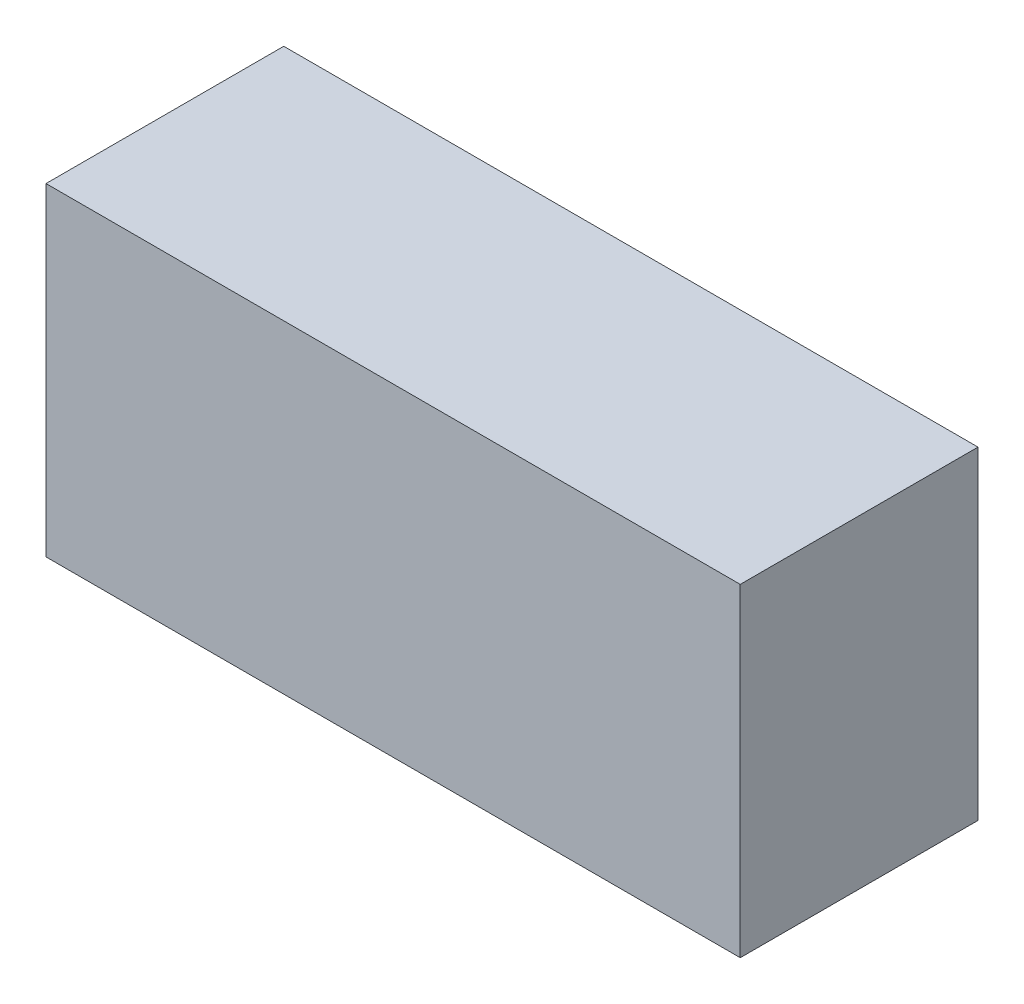
ISO-10303-21;
HEADER;
FILE_DESCRIPTION(('STEP AP214'),'2;1');
FILE_NAME('part.step','',(''),(''),'','','');
FILE_SCHEMA(('AUTOMOTIVE_DESIGN { 1 0 10303 214 1 1 1 1 }'));
ENDSEC;
DATA;
#1=APPLICATION_CONTEXT('core data for automotive mechanical design processes');
#2=APPLICATION_PROTOCOL_DEFINITION('international standard','automotive_design',2000,#1);
#3=PRODUCT_CONTEXT('',#1,'mechanical');
#4=PRODUCT('Part','Part','',(#3));
#5=PRODUCT_RELATED_PRODUCT_CATEGORY('part','',(#4));
#6=PRODUCT_DEFINITION_FORMATION('','',#4);
#7=PRODUCT_DEFINITION_CONTEXT('part definition',#1,'design');
#8=PRODUCT_DEFINITION('design','',#6,#7);
#9=PRODUCT_DEFINITION_SHAPE('','',#8);
#10=(LENGTH_UNIT() NAMED_UNIT(*) SI_UNIT(.MILLI.,.METRE.));
#11=(NAMED_UNIT(*) PLANE_ANGLE_UNIT() SI_UNIT($,.RADIAN.));
#12=(NAMED_UNIT(*) SI_UNIT($,.STERADIAN.) SOLID_ANGLE_UNIT());
#13=UNCERTAINTY_MEASURE_WITH_UNIT(LENGTH_MEASURE(1.E-05),#10,'distance_accuracy_value','');
#14=(GEOMETRIC_REPRESENTATION_CONTEXT(3) GLOBAL_UNCERTAINTY_ASSIGNED_CONTEXT((#13)) GLOBAL_UNIT_ASSIGNED_CONTEXT((#10,
#11,#12)) REPRESENTATION_CONTEXT('',''));
#15=CARTESIAN_POINT('',(0.,0.,0.));
#16=DIRECTION('',(0.,0.,1.));
#17=DIRECTION('',(1.,0.,0.));
#18=AXIS2_PLACEMENT_3D('',#15,#16,#17);
#19=CARTESIAN_POINT('',(36.5,34.,12.5));
#20=DIRECTION('',(-1.,0.,0.));
#21=DIRECTION('',(0.,0.,1.));
#22=AXIS2_PLACEMENT_3D('',#19,#20,#21);
#23=PLANE('',#22);
#24=DIRECTION('',(0.,0.,-1.));
#25=VECTOR('',#24,1.);
#26=CARTESIAN_POINT('',(36.5,0.,12.5));
#27=LINE('',#26,#25);
#28=CARTESIAN_POINT('',(36.5,0.,12.5));
#29=VERTEX_POINT('',#28);
#30=CARTESIAN_POINT('',(36.5,0.,-12.5));
#31=VERTEX_POINT('',#30);
#32=EDGE_CURVE('E105',#29,#31,#27,.T.);
#33=ORIENTED_EDGE('',*,*,#32,.T.);
#34=DIRECTION('',(0.,-1.,0.));
#35=VECTOR('',#34,1.);
#36=CARTESIAN_POINT('',(36.5,34.,-12.5));
#37=LINE('',#36,#35);
#38=CARTESIAN_POINT('',(36.5,34.,-12.5));
#39=VERTEX_POINT('',#38);
#40=EDGE_CURVE('E11',#39,#31,#37,.T.);
#41=ORIENTED_EDGE('',*,*,#40,.F.);
#42=DIRECTION('',(0.,0.,-1.));
#43=VECTOR('',#42,1.);
#44=CARTESIAN_POINT('',(36.5,34.,12.5));
#45=LINE('',#44,#43);
#46=CARTESIAN_POINT('',(36.5,34.,12.5));
#47=VERTEX_POINT('',#46);
#48=EDGE_CURVE('E89',#47,#39,#45,.T.);
#49=ORIENTED_EDGE('',*,*,#48,.F.);
#50=DIRECTION('',(0.,-1.,0.));
#51=VECTOR('',#50,1.);
#52=CARTESIAN_POINT('',(36.5,34.,12.5));
#53=LINE('',#52,#51);
#54=EDGE_CURVE('E97',#47,#29,#53,.T.);
#55=ORIENTED_EDGE('',*,*,#54,.T.);
#56=EDGE_LOOP('',(#33,#41,#49,#55));
#57=FACE_BOUND('',#56,.T.);
#58=ADVANCED_FACE('F39',(#57),#23,.F.);
#59=CARTESIAN_POINT('',(-36.5,34.,-12.5));
#60=DIRECTION('',(0.,0.,1.));
#61=DIRECTION('',(1.,0.,0.));
#62=AXIS2_PLACEMENT_3D('',#59,#60,#61);
#63=PLANE('',#62);
#64=DIRECTION('',(-1.,0.,0.));
#65=VECTOR('',#64,1.);
#66=CARTESIAN_POINT('',(-36.5,0.,-12.5));
#67=LINE('',#66,#65);
#68=CARTESIAN_POINT('',(-36.5,0.,-12.5));
#69=VERTEX_POINT('',#68);
#70=EDGE_CURVE('E92',#31,#69,#67,.T.);
#71=ORIENTED_EDGE('',*,*,#70,.T.);
#72=DIRECTION('',(0.,-1.,0.));
#73=VECTOR('',#72,1.);
#74=CARTESIAN_POINT('',(-36.5,34.,-12.5));
#75=LINE('',#74,#73);
#76=CARTESIAN_POINT('',(-36.5,34.,-12.5));
#77=VERTEX_POINT('',#76);
#78=EDGE_CURVE('E50',#77,#69,#75,.T.);
#79=ORIENTED_EDGE('',*,*,#78,.F.);
#80=DIRECTION('',(-1.,0.,0.));
#81=VECTOR('',#80,1.);
#82=CARTESIAN_POINT('',(-36.5,34.,-12.5));
#83=LINE('',#82,#81);
#84=EDGE_CURVE('E82',#39,#77,#83,.T.);
#85=ORIENTED_EDGE('',*,*,#84,.F.);
#86=ORIENTED_EDGE('',*,*,#40,.T.);
#87=EDGE_LOOP('',(#71,#79,#85,#86));
#88=FACE_BOUND('',#87,.T.);
#89=ADVANCED_FACE('F93',(#88),#63,.F.);
#90=CARTESIAN_POINT('',(-36.5,34.,12.5));
#91=DIRECTION('',(1.,0.,0.));
#92=DIRECTION('',(0.,0.,-1.));
#93=AXIS2_PLACEMENT_3D('',#90,#91,#92);
#94=PLANE('',#93);
#95=DIRECTION('',(0.,0.,1.));
#96=VECTOR('',#95,1.);
#97=CARTESIAN_POINT('',(-36.5,0.,12.5));
#98=LINE('',#97,#96);
#99=CARTESIAN_POINT('',(-36.5,0.,12.5));
#100=VERTEX_POINT('',#99);
#101=EDGE_CURVE('E72',#69,#100,#98,.T.);
#102=ORIENTED_EDGE('',*,*,#101,.T.);
#103=DIRECTION('',(0.,-1.,0.));
#104=VECTOR('',#103,1.);
#105=CARTESIAN_POINT('',(-36.5,34.,12.5));
#106=LINE('',#105,#104);
#107=CARTESIAN_POINT('',(-36.5,34.,12.5));
#108=VERTEX_POINT('',#107);
#109=EDGE_CURVE('E94',#108,#100,#106,.T.);
#110=ORIENTED_EDGE('',*,*,#109,.F.);
#111=DIRECTION('',(0.,0.,1.));
#112=VECTOR('',#111,1.);
#113=CARTESIAN_POINT('',(-36.5,34.,12.5));
#114=LINE('',#113,#112);
#115=EDGE_CURVE('E88',#77,#108,#114,.T.);
#116=ORIENTED_EDGE('',*,*,#115,.F.);
#117=ORIENTED_EDGE('',*,*,#78,.T.);
#118=EDGE_LOOP('',(#102,#110,#116,#117));
#119=FACE_BOUND('',#118,.T.);
#120=ADVANCED_FACE('F96',(#119),#94,.F.);
#121=CARTESIAN_POINT('',(-36.5,34.,12.5));
#122=DIRECTION('',(0.,0.,-1.));
#123=DIRECTION('',(-1.,0.,0.));
#124=AXIS2_PLACEMENT_3D('',#121,#122,#123);
#125=PLANE('',#124);
#126=DIRECTION('',(1.,0.,0.));
#127=VECTOR('',#126,1.);
#128=CARTESIAN_POINT('',(-36.5,0.,12.5));
#129=LINE('',#128,#127);
#130=EDGE_CURVE('E76',#100,#29,#129,.T.);
#131=ORIENTED_EDGE('',*,*,#130,.T.);
#132=ORIENTED_EDGE('',*,*,#54,.F.);
#133=DIRECTION('',(1.,0.,0.));
#134=VECTOR('',#133,1.);
#135=CARTESIAN_POINT('',(-36.5,34.,12.5));
#136=LINE('',#135,#134);
#137=EDGE_CURVE('E54',#108,#47,#136,.T.);
#138=ORIENTED_EDGE('',*,*,#137,.F.);
#139=ORIENTED_EDGE('',*,*,#109,.T.);
#140=EDGE_LOOP('',(#131,#132,#138,#139));
#141=FACE_BOUND('',#140,.T.);
#142=ADVANCED_FACE('F108',(#141),#125,.F.);
#143=CARTESIAN_POINT('',(0.,34.,0.));
#144=DIRECTION('',(0.,-1.,0.));
#145=DIRECTION('',(0.,0.,-1.));
#146=AXIS2_PLACEMENT_3D('',#143,#144,#145);
#147=PLANE('',#146);
#148=ORIENTED_EDGE('',*,*,#48,.T.);
#149=ORIENTED_EDGE('',*,*,#84,.T.);
#150=ORIENTED_EDGE('',*,*,#115,.T.);
#151=ORIENTED_EDGE('',*,*,#137,.T.);
#152=EDGE_LOOP('',(#148,#149,#150,#151));
#153=FACE_BOUND('',#152,.T.);
#154=ADVANCED_FACE('F86',(#153),#147,.F.);
#155=CARTESIAN_POINT('',(0.,0.,0.));
#156=DIRECTION('',(0.,-1.,0.));
#157=DIRECTION('',(0.,0.,-1.));
#158=AXIS2_PLACEMENT_3D('',#155,#156,#157);
#159=PLANE('',#158);
#160=ORIENTED_EDGE('',*,*,#32,.F.);
#161=ORIENTED_EDGE('',*,*,#130,.F.);
#162=ORIENTED_EDGE('',*,*,#101,.F.);
#163=ORIENTED_EDGE('',*,*,#70,.F.);
#164=EDGE_LOOP('',(#160,#161,#162,#163));
#165=FACE_BOUND('',#164,.T.);
#166=ADVANCED_FACE('F115',(#165),#159,.T.);
#167=CLOSED_SHELL('',(#58,#89,#120,#142,#154,#166));
#168=MANIFOLD_SOLID_BREP('B2',#167);
#169=ADVANCED_BREP_SHAPE_REPRESENTATION('',(#18,#168),#14);
#170=SHAPE_DEFINITION_REPRESENTATION(#9,#169);
ENDSEC;
END-ISO-10303-21;
